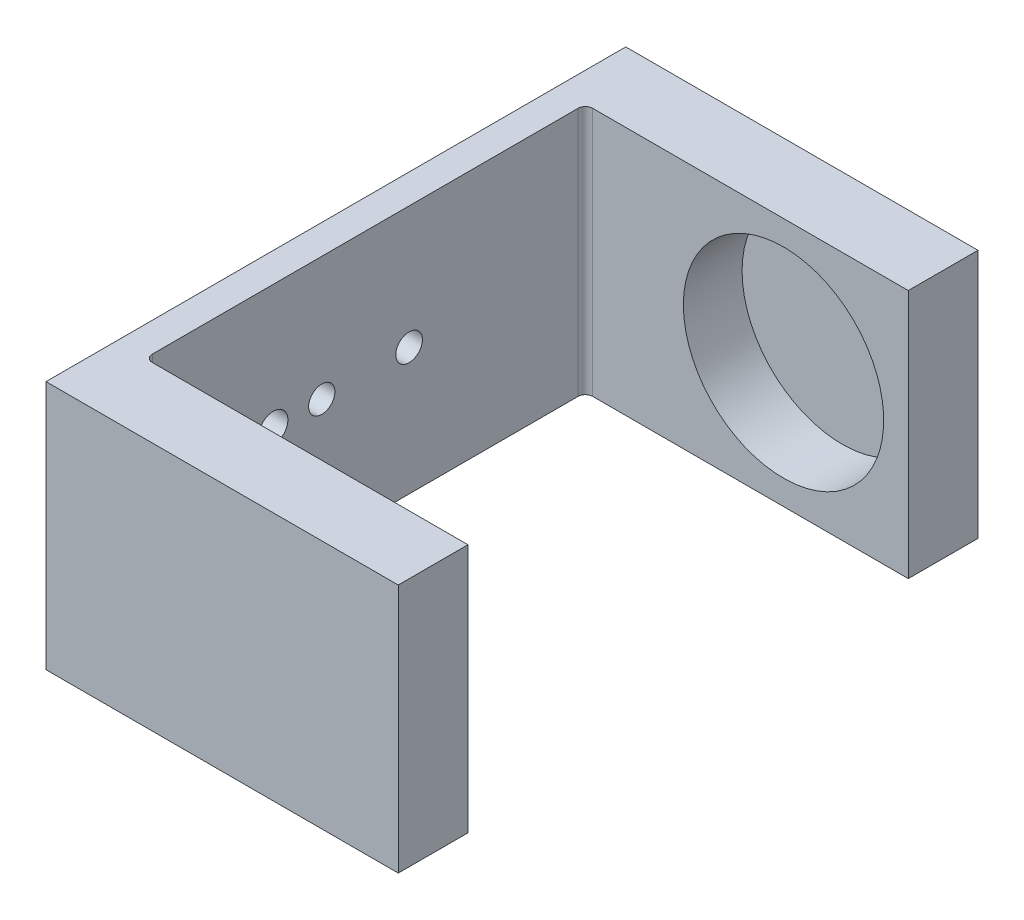
ISO-10303-21;
HEADER;
FILE_DESCRIPTION(('STEP AP214'),'2;1');
FILE_NAME('part.step','',(''),(''),'','','');
FILE_SCHEMA(('AUTOMOTIVE_DESIGN { 1 0 10303 214 1 1 1 1 }'));
ENDSEC;
DATA;
#1=APPLICATION_CONTEXT('core data for automotive mechanical design processes');
#2=APPLICATION_PROTOCOL_DEFINITION('international standard','automotive_design',2000,#1);
#3=PRODUCT_CONTEXT('',#1,'mechanical');
#4=PRODUCT('Part','Part','',(#3));
#5=PRODUCT_RELATED_PRODUCT_CATEGORY('part','',(#4));
#6=PRODUCT_DEFINITION_FORMATION('','',#4);
#7=PRODUCT_DEFINITION_CONTEXT('part definition',#1,'design');
#8=PRODUCT_DEFINITION('design','',#6,#7);
#9=PRODUCT_DEFINITION_SHAPE('','',#8);
#10=(LENGTH_UNIT() NAMED_UNIT(*) SI_UNIT(.MILLI.,.METRE.));
#11=(NAMED_UNIT(*) PLANE_ANGLE_UNIT() SI_UNIT($,.RADIAN.));
#12=(NAMED_UNIT(*) SI_UNIT($,.STERADIAN.) SOLID_ANGLE_UNIT());
#13=UNCERTAINTY_MEASURE_WITH_UNIT(LENGTH_MEASURE(1.E-05),#10,'distance_accuracy_value','');
#14=(GEOMETRIC_REPRESENTATION_CONTEXT(3) GLOBAL_UNCERTAINTY_ASSIGNED_CONTEXT((#13)) GLOBAL_UNIT_ASSIGNED_CONTEXT((#10,
#11,#12)) REPRESENTATION_CONTEXT('',''));
#15=CARTESIAN_POINT('',(0.,0.,0.));
#16=DIRECTION('',(0.,0.,1.));
#17=DIRECTION('',(1.,0.,0.));
#18=AXIS2_PLACEMENT_3D('',#15,#16,#17);
#19=CARTESIAN_POINT('',(0.,0.,0.));
#20=DIRECTION('',(1.,0.,0.));
#21=DIRECTION('',(0.,0.,-1.));
#22=AXIS2_PLACEMENT_3D('',#19,#20,#21);
#23=PLANE('',#22);
#24=CARTESIAN_POINT('',(0.,0.0292516399309797,15.0223875708356));
#25=DIRECTION('',(1.,0.,0.));
#26=DIRECTION('',(0.,0.,-1.));
#27=AXIS2_PLACEMENT_3D('',#24,#25,#26);
#28=CIRCLE('',#27,1.98896117743456);
#29=CARTESIAN_POINT('',(0.,0.0292516399309797,13.0334263934011));
#30=VERTEX_POINT('',#29);
#31=EDGE_CURVE('E257',#30,#30,#28,.T.);
#32=ORIENTED_EDGE('',*,*,#31,.F.);
#33=EDGE_LOOP('',(#32));
#34=FACE_BOUND('',#33,.T.);
#35=CARTESIAN_POINT('',(0.,0.314468999115995,-3.47781030124664));
#36=DIRECTION('',(1.,0.,0.));
#37=DIRECTION('',(0.,0.,-1.));
#38=AXIS2_PLACEMENT_3D('',#35,#36,#37);
#39=CIRCLE('',#38,1.81700148558305);
#40=CARTESIAN_POINT('',(0.,0.314468999115995,-5.29481178682969));
#41=VERTEX_POINT('',#40);
#42=EDGE_CURVE('E252',#41,#41,#39,.T.);
#43=ORIENTED_EDGE('',*,*,#42,.F.);
#44=EDGE_LOOP('',(#43));
#45=FACE_BOUND('',#44,.T.);
#46=CARTESIAN_POINT('',(0.,0.135590330107091,8.42214558473276));
#47=DIRECTION('',(1.,0.,0.));
#48=DIRECTION('',(0.,0.,-1.));
#49=AXIS2_PLACEMENT_3D('',#46,#47,#48);
#50=CIRCLE('',#49,1.79263833687023);
#51=CARTESIAN_POINT('',(0.,0.135590330107091,6.62950724786254));
#52=VERTEX_POINT('',#51);
#53=EDGE_CURVE('E172',#52,#52,#50,.T.);
#54=ORIENTED_EDGE('',*,*,#53,.F.);
#55=EDGE_LOOP('',(#54));
#56=FACE_BOUND('',#55,.T.);
#57=DIRECTION('',(0.,0.,-1.));
#58=VECTOR('',#57,1.);
#59=CARTESIAN_POINT('',(0.,-17.,32.5));
#60=LINE('',#59,#58);
#61=CARTESIAN_POINT('',(0.,-17.,31.5));
#62=VERTEX_POINT('',#61);
#63=CARTESIAN_POINT('',(0.,-17.,-26.5));
#64=VERTEX_POINT('',#63);
#65=EDGE_CURVE('E121',#62,#64,#60,.T.);
#66=ORIENTED_EDGE('',*,*,#65,.T.);
#67=DIRECTION('',(0.,1.,0.));
#68=VECTOR('',#67,1.);
#69=CARTESIAN_POINT('',(0.,0.,-26.5));
#70=LINE('',#69,#68);
#71=CARTESIAN_POINT('',(0.,17.,-26.5));
#72=VERTEX_POINT('',#71);
#73=EDGE_CURVE('E193',#64,#72,#70,.T.);
#74=ORIENTED_EDGE('',*,*,#73,.T.);
#75=DIRECTION('',(0.,0.,1.));
#76=VECTOR('',#75,1.);
#77=CARTESIAN_POINT('',(0.,17.,32.5));
#78=LINE('',#77,#76);
#79=CARTESIAN_POINT('',(0.,17.,31.5));
#80=VERTEX_POINT('',#79);
#81=EDGE_CURVE('E176',#72,#80,#78,.T.);
#82=ORIENTED_EDGE('',*,*,#81,.T.);
#83=DIRECTION('',(0.,-1.,0.));
#84=VECTOR('',#83,1.);
#85=CARTESIAN_POINT('',(0.,0.,31.5));
#86=LINE('',#85,#84);
#87=EDGE_CURVE('E180',#80,#62,#86,.T.);
#88=ORIENTED_EDGE('',*,*,#87,.T.);
#89=EDGE_LOOP('',(#66,#74,#82,#88));
#90=FACE_BOUND('',#89,.T.);
#91=ADVANCED_FACE('F33',(#34,#45,#56,#90),#23,.T.);
#92=CARTESIAN_POINT('',(-4.,-17.,32.5));
#93=DIRECTION('',(0.,-1.,0.));
#94=DIRECTION('',(0.,0.,-1.));
#95=AXIS2_PLACEMENT_3D('',#92,#93,#94);
#96=PLANE('',#95);
#97=DIRECTION('',(1.,0.,0.));
#98=VECTOR('',#97,1.);
#99=CARTESIAN_POINT('',(-4.,-17.,-27.5));
#100=LINE('',#99,#98);
#101=CARTESIAN_POINT('',(1.,-17.,-27.5));
#102=VERTEX_POINT('',#101);
#103=CARTESIAN_POINT('',(44.,-17.,-27.5));
#104=VERTEX_POINT('',#103);
#105=EDGE_CURVE('E131',#102,#104,#100,.T.);
#106=ORIENTED_EDGE('',*,*,#105,.F.);
#107=CARTESIAN_POINT('',(1.,-17.,-26.5));
#108=DIRECTION('',(0.,-1.,0.));
#109=DIRECTION('',(0.,0.,-1.));
#110=AXIS2_PLACEMENT_3D('',#107,#108,#109);
#111=CIRCLE('',#110,1.);
#112=EDGE_CURVE('E11',#102,#64,#111,.F.);
#113=ORIENTED_EDGE('',*,*,#112,.T.);
#114=ORIENTED_EDGE('',*,*,#65,.F.);
#115=CARTESIAN_POINT('',(1.,-17.,31.5));
#116=DIRECTION('',(0.,-1.,0.));
#117=DIRECTION('',(0.,0.,-1.));
#118=AXIS2_PLACEMENT_3D('',#115,#116,#117);
#119=CIRCLE('',#118,1.);
#120=CARTESIAN_POINT('',(1.,-17.,32.5));
#121=VERTEX_POINT('',#120);
#122=EDGE_CURVE('E188',#62,#121,#119,.F.);
#123=ORIENTED_EDGE('',*,*,#122,.T.);
#124=DIRECTION('',(1.,0.,0.));
#125=VECTOR('',#124,1.);
#126=CARTESIAN_POINT('',(-4.,-17.,32.5));
#127=LINE('',#126,#125);
#128=CARTESIAN_POINT('',(44.,-17.,32.5));
#129=VERTEX_POINT('',#128);
#130=EDGE_CURVE('E152',#121,#129,#127,.T.);
#131=ORIENTED_EDGE('',*,*,#130,.T.);
#132=DIRECTION('',(0.,0.,-1.));
#133=VECTOR('',#132,1.);
#134=CARTESIAN_POINT('',(44.,-17.,42.));
#135=LINE('',#134,#133);
#136=CARTESIAN_POINT('',(44.,-17.,42.));
#137=VERTEX_POINT('',#136);
#138=EDGE_CURVE('E169',#137,#129,#135,.T.);
#139=ORIENTED_EDGE('',*,*,#138,.F.);
#140=DIRECTION('',(1.,0.,0.));
#141=VECTOR('',#140,1.);
#142=CARTESIAN_POINT('',(-4.,-17.,42.));
#143=LINE('',#142,#141);
#144=CARTESIAN_POINT('',(-4.,-17.,42.));
#145=VERTEX_POINT('',#144);
#146=EDGE_CURVE('E154',#145,#137,#143,.T.);
#147=ORIENTED_EDGE('',*,*,#146,.F.);
#148=DIRECTION('',(0.,0.,-1.));
#149=VECTOR('',#148,1.);
#150=CARTESIAN_POINT('',(-4.,-17.,32.5));
#151=LINE('',#150,#149);
#152=CARTESIAN_POINT('',(-4.,-17.,-37.));
#153=VERTEX_POINT('',#152);
#154=EDGE_CURVE('E120',#145,#153,#151,.T.);
#155=ORIENTED_EDGE('',*,*,#154,.T.);
#156=DIRECTION('',(1.,0.,0.));
#157=VECTOR('',#156,1.);
#158=CARTESIAN_POINT('',(-4.,-17.,-37.));
#159=LINE('',#158,#157);
#160=CARTESIAN_POINT('',(44.,-17.,-37.));
#161=VERTEX_POINT('',#160);
#162=EDGE_CURVE('E130',#153,#161,#159,.T.);
#163=ORIENTED_EDGE('',*,*,#162,.T.);
#164=DIRECTION('',(0.,0.,1.));
#165=VECTOR('',#164,1.);
#166=CARTESIAN_POINT('',(44.,-17.,-37.));
#167=LINE('',#166,#165);
#168=EDGE_CURVE('E141',#161,#104,#167,.T.);
#169=ORIENTED_EDGE('',*,*,#168,.T.);
#170=EDGE_LOOP('',(#106,#113,#114,#123,#131,#139,#147,#155,#163,#169));
#171=FACE_BOUND('',#170,.T.);
#172=ADVANCED_FACE('F208',(#171),#96,.T.);
#173=CARTESIAN_POINT('',(-4.,17.,32.5));
#174=DIRECTION('',(0.,1.,0.));
#175=DIRECTION('',(0.,0.,1.));
#176=AXIS2_PLACEMENT_3D('',#173,#174,#175);
#177=PLANE('',#176);
#178=DIRECTION('',(0.,0.,1.));
#179=VECTOR('',#178,1.);
#180=CARTESIAN_POINT('',(-4.,17.,32.5));
#181=LINE('',#180,#179);
#182=CARTESIAN_POINT('',(-4.,17.,-37.));
#183=VERTEX_POINT('',#182);
#184=CARTESIAN_POINT('',(-4.,17.,42.));
#185=VERTEX_POINT('',#184);
#186=EDGE_CURVE('E109',#183,#185,#181,.T.);
#187=ORIENTED_EDGE('',*,*,#186,.T.);
#188=DIRECTION('',(-1.,0.,0.));
#189=VECTOR('',#188,1.);
#190=CARTESIAN_POINT('',(-4.,17.,42.));
#191=LINE('',#190,#189);
#192=CARTESIAN_POINT('',(44.,17.,42.));
#193=VERTEX_POINT('',#192);
#194=EDGE_CURVE('E159',#193,#185,#191,.T.);
#195=ORIENTED_EDGE('',*,*,#194,.F.);
#196=DIRECTION('',(0.,0.,-1.));
#197=VECTOR('',#196,1.);
#198=CARTESIAN_POINT('',(44.,17.,42.));
#199=LINE('',#198,#197);
#200=CARTESIAN_POINT('',(44.,17.,32.5));
#201=VERTEX_POINT('',#200);
#202=EDGE_CURVE('E161',#193,#201,#199,.T.);
#203=ORIENTED_EDGE('',*,*,#202,.T.);
#204=DIRECTION('',(-1.,0.,0.));
#205=VECTOR('',#204,1.);
#206=CARTESIAN_POINT('',(-4.,17.,32.5));
#207=LINE('',#206,#205);
#208=CARTESIAN_POINT('',(1.,17.,32.5));
#209=VERTEX_POINT('',#208);
#210=EDGE_CURVE('E155',#201,#209,#207,.T.);
#211=ORIENTED_EDGE('',*,*,#210,.T.);
#212=CARTESIAN_POINT('',(1.,17.,31.5));
#213=DIRECTION('',(0.,1.,0.));
#214=DIRECTION('',(0.,0.,1.));
#215=AXIS2_PLACEMENT_3D('',#212,#213,#214);
#216=CIRCLE('',#215,1.);
#217=EDGE_CURVE('E190',#209,#80,#216,.F.);
#218=ORIENTED_EDGE('',*,*,#217,.T.);
#219=ORIENTED_EDGE('',*,*,#81,.F.);
#220=CARTESIAN_POINT('',(1.,17.,-26.5));
#221=DIRECTION('',(0.,1.,0.));
#222=DIRECTION('',(0.,0.,1.));
#223=AXIS2_PLACEMENT_3D('',#220,#221,#222);
#224=CIRCLE('',#223,1.);
#225=CARTESIAN_POINT('',(1.,17.,-27.5));
#226=VERTEX_POINT('',#225);
#227=EDGE_CURVE('E41',#72,#226,#224,.F.);
#228=ORIENTED_EDGE('',*,*,#227,.T.);
#229=DIRECTION('',(-1.,0.,0.));
#230=VECTOR('',#229,1.);
#231=CARTESIAN_POINT('',(-4.,17.,-27.5));
#232=LINE('',#231,#230);
#233=CARTESIAN_POINT('',(44.,17.,-27.5));
#234=VERTEX_POINT('',#233);
#235=EDGE_CURVE('E142',#234,#226,#232,.T.);
#236=ORIENTED_EDGE('',*,*,#235,.F.);
#237=DIRECTION('',(0.,0.,1.));
#238=VECTOR('',#237,1.);
#239=CARTESIAN_POINT('',(44.,17.,-37.));
#240=LINE('',#239,#238);
#241=CARTESIAN_POINT('',(44.,17.,-37.));
#242=VERTEX_POINT('',#241);
#243=EDGE_CURVE('E134',#242,#234,#240,.T.);
#244=ORIENTED_EDGE('',*,*,#243,.F.);
#245=DIRECTION('',(-1.,0.,0.));
#246=VECTOR('',#245,1.);
#247=CARTESIAN_POINT('',(-4.,17.,-37.));
#248=LINE('',#247,#246);
#249=EDGE_CURVE('E127',#242,#183,#248,.T.);
#250=ORIENTED_EDGE('',*,*,#249,.T.);
#251=EDGE_LOOP('',(#187,#195,#203,#211,#218,#219,#228,#236,#244,#250));
#252=FACE_BOUND('',#251,.T.);
#253=ADVANCED_FACE('F133',(#252),#177,.T.);
#254=CARTESIAN_POINT('',(-4.,0.,0.));
#255=DIRECTION('',(1.,0.,0.));
#256=DIRECTION('',(0.,0.,-1.));
#257=AXIS2_PLACEMENT_3D('',#254,#255,#256);
#258=PLANE('',#257);
#259=CARTESIAN_POINT('',(-4.,0.0292516399309797,15.0223875708356));
#260=DIRECTION('',(-1.,0.,0.));
#261=DIRECTION('',(0.,0.,1.));
#262=AXIS2_PLACEMENT_3D('',#259,#260,#261);
#263=CIRCLE('',#262,1.98896117743456);
#264=CARTESIAN_POINT('',(-4.,0.0292516399309797,17.0113487482702));
#265=VERTEX_POINT('',#264);
#266=EDGE_CURVE('E246',#265,#265,#263,.T.);
#267=ORIENTED_EDGE('',*,*,#266,.F.);
#268=EDGE_LOOP('',(#267));
#269=FACE_BOUND('',#268,.T.);
#270=CARTESIAN_POINT('',(-4.,0.314468999115995,-3.47781030124664));
#271=DIRECTION('',(-1.,0.,0.));
#272=DIRECTION('',(0.,0.,1.));
#273=AXIS2_PLACEMENT_3D('',#270,#271,#272);
#274=CIRCLE('',#273,1.81700148558305);
#275=CARTESIAN_POINT('',(-4.,0.314468999115995,-1.66080881566359));
#276=VERTEX_POINT('',#275);
#277=EDGE_CURVE('E249',#276,#276,#274,.T.);
#278=ORIENTED_EDGE('',*,*,#277,.F.);
#279=EDGE_LOOP('',(#278));
#280=FACE_BOUND('',#279,.T.);
#281=DIRECTION('',(0.,-1.,0.));
#282=VECTOR('',#281,1.);
#283=CARTESIAN_POINT('',(-4.,17.,-37.));
#284=LINE('',#283,#282);
#285=EDGE_CURVE('E113',#183,#153,#284,.T.);
#286=ORIENTED_EDGE('',*,*,#285,.T.);
#287=ORIENTED_EDGE('',*,*,#154,.F.);
#288=DIRECTION('',(0.,-1.,0.));
#289=VECTOR('',#288,1.);
#290=CARTESIAN_POINT('',(-4.,17.,42.));
#291=LINE('',#290,#289);
#292=EDGE_CURVE('E116',#185,#145,#291,.T.);
#293=ORIENTED_EDGE('',*,*,#292,.F.);
#294=ORIENTED_EDGE('',*,*,#186,.F.);
#295=EDGE_LOOP('',(#286,#287,#293,#294));
#296=FACE_BOUND('',#295,.T.);
#297=CARTESIAN_POINT('',(-4.,0.135590330107091,8.42214558473276));
#298=DIRECTION('',(1.,0.,0.));
#299=DIRECTION('',(0.,0.,-1.));
#300=AXIS2_PLACEMENT_3D('',#297,#298,#299);
#301=CIRCLE('',#300,1.79263833687023);
#302=CARTESIAN_POINT('',(-4.,0.135590330107091,6.62950724786254));
#303=VERTEX_POINT('',#302);
#304=EDGE_CURVE('E173',#303,#303,#301,.T.);
#305=ORIENTED_EDGE('',*,*,#304,.T.);
#306=EDGE_LOOP('',(#305));
#307=FACE_BOUND('',#306,.T.);
#308=ADVANCED_FACE('F111',(#269,#280,#296,#307),#258,.F.);
#309=CARTESIAN_POINT('',(-4.,0.135590330107091,8.42214558473276));
#310=DIRECTION('',(1.,0.,0.));
#311=DIRECTION('',(0.,0.,-1.));
#312=AXIS2_PLACEMENT_3D('',#309,#310,#311);
#313=CYLINDRICAL_SURFACE('',#312,1.79263833687023);
#314=ORIENTED_EDGE('',*,*,#304,.F.);
#315=EDGE_LOOP('',(#314));
#316=FACE_BOUND('',#315,.T.);
#317=ORIENTED_EDGE('',*,*,#53,.T.);
#318=EDGE_LOOP('',(#317));
#319=FACE_BOUND('',#318,.T.);
#320=ADVANCED_FACE('F236',(#316,#319),#313,.F.);
#321=CARTESIAN_POINT('',(44.,17.,42.));
#322=DIRECTION('',(-1.,0.,0.));
#323=DIRECTION('',(0.,-1.,0.));
#324=AXIS2_PLACEMENT_3D('',#321,#322,#323);
#325=PLANE('',#324);
#326=DIRECTION('',(0.,1.,0.));
#327=VECTOR('',#326,1.);
#328=CARTESIAN_POINT('',(44.,17.,32.5));
#329=LINE('',#328,#327);
#330=EDGE_CURVE('E163',#129,#201,#329,.T.);
#331=ORIENTED_EDGE('',*,*,#330,.T.);
#332=ORIENTED_EDGE('',*,*,#202,.F.);
#333=DIRECTION('',(0.,1.,0.));
#334=VECTOR('',#333,1.);
#335=CARTESIAN_POINT('',(44.,17.,42.));
#336=LINE('',#335,#334);
#337=EDGE_CURVE('E157',#137,#193,#336,.T.);
#338=ORIENTED_EDGE('',*,*,#337,.F.);
#339=ORIENTED_EDGE('',*,*,#138,.T.);
#340=EDGE_LOOP('',(#331,#332,#338,#339));
#341=FACE_BOUND('',#340,.T.);
#342=ADVANCED_FACE('F241',(#341),#325,.F.);
#343=CARTESIAN_POINT('',(0.,0.,42.));
#344=DIRECTION('',(0.,0.,1.));
#345=DIRECTION('',(1.,0.,0.));
#346=AXIS2_PLACEMENT_3D('',#343,#344,#345);
#347=PLANE('',#346);
#348=ORIENTED_EDGE('',*,*,#292,.T.);
#349=ORIENTED_EDGE('',*,*,#146,.T.);
#350=ORIENTED_EDGE('',*,*,#337,.T.);
#351=ORIENTED_EDGE('',*,*,#194,.T.);
#352=EDGE_LOOP('',(#348,#349,#350,#351));
#353=FACE_BOUND('',#352,.T.);
#354=ADVANCED_FACE('F276',(#353),#347,.T.);
#355=CARTESIAN_POINT('',(0.,0.,32.5));
#356=DIRECTION('',(0.,0.,1.));
#357=DIRECTION('',(1.,0.,0.));
#358=AXIS2_PLACEMENT_3D('',#355,#356,#357);
#359=PLANE('',#358);
#360=CARTESIAN_POINT('',(27.,0.,32.5));
#361=DIRECTION('',(0.,0.,-1.));
#362=DIRECTION('',(-1.,0.,0.));
#363=AXIS2_PLACEMENT_3D('',#360,#361,#362);
#364=CIRCLE('',#363,13.65);
#365=CARTESIAN_POINT('',(13.35,0.,32.5));
#366=VERTEX_POINT('',#365);
#367=EDGE_CURVE('E264',#366,#366,#364,.T.);
#368=ORIENTED_EDGE('',*,*,#367,.F.);
#369=EDGE_LOOP('',(#368));
#370=FACE_BOUND('',#369,.T.);
#371=ORIENTED_EDGE('',*,*,#130,.F.);
#372=DIRECTION('',(0.,-1.,0.));
#373=VECTOR('',#372,1.);
#374=CARTESIAN_POINT('',(1.,0.,32.5));
#375=LINE('',#374,#373);
#376=EDGE_CURVE('E186',#121,#209,#375,.F.);
#377=ORIENTED_EDGE('',*,*,#376,.T.);
#378=ORIENTED_EDGE('',*,*,#210,.F.);
#379=ORIENTED_EDGE('',*,*,#330,.F.);
#380=EDGE_LOOP('',(#371,#377,#378,#379));
#381=FACE_BOUND('',#380,.T.);
#382=ADVANCED_FACE('F272',(#370,#381),#359,.F.);
#383=CARTESIAN_POINT('',(44.,17.,-37.));
#384=DIRECTION('',(1.,0.,0.));
#385=DIRECTION('',(0.,1.,0.));
#386=AXIS2_PLACEMENT_3D('',#383,#384,#385);
#387=PLANE('',#386);
#388=DIRECTION('',(0.,1.,0.));
#389=VECTOR('',#388,1.);
#390=CARTESIAN_POINT('',(44.,17.,-27.5));
#391=LINE('',#390,#389);
#392=EDGE_CURVE('E144',#104,#234,#391,.T.);
#393=ORIENTED_EDGE('',*,*,#392,.F.);
#394=ORIENTED_EDGE('',*,*,#168,.F.);
#395=DIRECTION('',(0.,1.,0.));
#396=VECTOR('',#395,1.);
#397=CARTESIAN_POINT('',(44.,17.,-37.));
#398=LINE('',#397,#396);
#399=EDGE_CURVE('E135',#161,#242,#398,.T.);
#400=ORIENTED_EDGE('',*,*,#399,.T.);
#401=ORIENTED_EDGE('',*,*,#243,.T.);
#402=EDGE_LOOP('',(#393,#394,#400,#401));
#403=FACE_BOUND('',#402,.T.);
#404=ADVANCED_FACE('F275',(#403),#387,.T.);
#405=CARTESIAN_POINT('',(0.,0.,-37.));
#406=DIRECTION('',(0.,0.,-1.));
#407=DIRECTION('',(1.,0.,0.));
#408=AXIS2_PLACEMENT_3D('',#405,#406,#407);
#409=PLANE('',#408);
#410=ORIENTED_EDGE('',*,*,#285,.F.);
#411=ORIENTED_EDGE('',*,*,#249,.F.);
#412=ORIENTED_EDGE('',*,*,#399,.F.);
#413=ORIENTED_EDGE('',*,*,#162,.F.);
#414=EDGE_LOOP('',(#410,#411,#412,#413));
#415=FACE_BOUND('',#414,.T.);
#416=ADVANCED_FACE('F125',(#415),#409,.T.);
#417=CARTESIAN_POINT('',(0.,0.,-27.5));
#418=DIRECTION('',(0.,0.,-1.));
#419=DIRECTION('',(1.,0.,0.));
#420=AXIS2_PLACEMENT_3D('',#417,#418,#419);
#421=PLANE('',#420);
#422=CARTESIAN_POINT('',(27.,0.,-27.5));
#423=DIRECTION('',(0.,0.,-1.));
#424=DIRECTION('',(-1.,0.,0.));
#425=AXIS2_PLACEMENT_3D('',#422,#423,#424);
#426=CIRCLE('',#425,13.65);
#427=CARTESIAN_POINT('',(13.35,0.,-27.5));
#428=VERTEX_POINT('',#427);
#429=EDGE_CURVE('E260',#428,#428,#426,.T.);
#430=ORIENTED_EDGE('',*,*,#429,.T.);
#431=EDGE_LOOP('',(#430));
#432=FACE_BOUND('',#431,.T.);
#433=ORIENTED_EDGE('',*,*,#235,.T.);
#434=DIRECTION('',(0.,1.,0.));
#435=VECTOR('',#434,1.);
#436=CARTESIAN_POINT('',(1.,0.,-27.5));
#437=LINE('',#436,#435);
#438=EDGE_CURVE('E54',#226,#102,#437,.F.);
#439=ORIENTED_EDGE('',*,*,#438,.T.);
#440=ORIENTED_EDGE('',*,*,#105,.T.);
#441=ORIENTED_EDGE('',*,*,#392,.T.);
#442=EDGE_LOOP('',(#433,#439,#440,#441));
#443=FACE_BOUND('',#442,.T.);
#444=ADVANCED_FACE('F219',(#432,#443),#421,.F.);
#445=CARTESIAN_POINT('',(1.,0.,31.5));
#446=DIRECTION('',(0.,-1.,0.));
#447=DIRECTION('',(0.,0.,-1.));
#448=AXIS2_PLACEMENT_3D('',#445,#446,#447);
#449=CYLINDRICAL_SURFACE('',#448,1.);
#450=ORIENTED_EDGE('',*,*,#217,.F.);
#451=ORIENTED_EDGE('',*,*,#376,.F.);
#452=ORIENTED_EDGE('',*,*,#122,.F.);
#453=ORIENTED_EDGE('',*,*,#87,.F.);
#454=EDGE_LOOP('',(#450,#451,#452,#453));
#455=FACE_BOUND('',#454,.T.);
#456=ADVANCED_FACE('F206',(#455),#449,.F.);
#457=CARTESIAN_POINT('',(1.,0.,-26.5));
#458=DIRECTION('',(0.,1.,0.));
#459=DIRECTION('',(0.,0.,1.));
#460=AXIS2_PLACEMENT_3D('',#457,#458,#459);
#461=CYLINDRICAL_SURFACE('',#460,1.);
#462=ORIENTED_EDGE('',*,*,#112,.F.);
#463=ORIENTED_EDGE('',*,*,#438,.F.);
#464=ORIENTED_EDGE('',*,*,#227,.F.);
#465=ORIENTED_EDGE('',*,*,#73,.F.);
#466=EDGE_LOOP('',(#462,#463,#464,#465));
#467=FACE_BOUND('',#466,.T.);
#468=ADVANCED_FACE('F35',(#467),#461,.F.);
#469=CARTESIAN_POINT('',(27.,0.,40.5));
#470=DIRECTION('',(0.,0.,-1.));
#471=DIRECTION('',(-1.,0.,0.));
#472=AXIS2_PLACEMENT_3D('',#469,#470,#471);
#473=CYLINDRICAL_SURFACE('',#472,13.65);
#474=CARTESIAN_POINT('',(27.,0.,40.5));
#475=DIRECTION('',(0.,0.,-1.));
#476=DIRECTION('',(-1.,0.,0.));
#477=AXIS2_PLACEMENT_3D('',#474,#475,#476);
#478=CIRCLE('',#477,13.65);
#479=CARTESIAN_POINT('',(13.35,0.,40.5));
#480=VERTEX_POINT('',#479);
#481=EDGE_CURVE('E145',#480,#480,#478,.T.);
#482=ORIENTED_EDGE('',*,*,#481,.F.);
#483=EDGE_LOOP('',(#482));
#484=FACE_BOUND('',#483,.T.);
#485=ORIENTED_EDGE('',*,*,#367,.T.);
#486=EDGE_LOOP('',(#485));
#487=FACE_BOUND('',#486,.T.);
#488=ADVANCED_FACE('F211',(#484,#487),#473,.F.);
#489=CARTESIAN_POINT('',(27.,0.,40.5));
#490=DIRECTION('',(0.,0.,-1.));
#491=DIRECTION('',(-1.,0.,0.));
#492=AXIS2_PLACEMENT_3D('',#489,#490,#491);
#493=PLANE('',#492);
#494=ORIENTED_EDGE('',*,*,#481,.T.);
#495=EDGE_LOOP('',(#494));
#496=FACE_BOUND('',#495,.T.);
#497=ADVANCED_FACE('F216',(#496),#493,.T.);
#498=CARTESIAN_POINT('',(27.,0.,-35.5));
#499=DIRECTION('',(0.,0.,1.));
#500=DIRECTION('',(1.,0.,0.));
#501=AXIS2_PLACEMENT_3D('',#498,#499,#500);
#502=CYLINDRICAL_SURFACE('',#501,13.65);
#503=CARTESIAN_POINT('',(27.,0.,-35.5));
#504=DIRECTION('',(0.,0.,-1.));
#505=DIRECTION('',(-1.,0.,0.));
#506=AXIS2_PLACEMENT_3D('',#503,#504,#505);
#507=CIRCLE('',#506,13.65);
#508=CARTESIAN_POINT('',(13.35,0.,-35.5));
#509=VERTEX_POINT('',#508);
#510=EDGE_CURVE('E261',#509,#509,#507,.T.);
#511=ORIENTED_EDGE('',*,*,#510,.T.);
#512=EDGE_LOOP('',(#511));
#513=FACE_BOUND('',#512,.T.);
#514=ORIENTED_EDGE('',*,*,#429,.F.);
#515=EDGE_LOOP('',(#514));
#516=FACE_BOUND('',#515,.T.);
#517=ADVANCED_FACE('F360',(#513,#516),#502,.F.);
#518=CARTESIAN_POINT('',(27.,0.,-35.5));
#519=DIRECTION('',(0.,0.,1.));
#520=DIRECTION('',(-1.,0.,0.));
#521=AXIS2_PLACEMENT_3D('',#518,#519,#520);
#522=PLANE('',#521);
#523=ORIENTED_EDGE('',*,*,#510,.F.);
#524=EDGE_LOOP('',(#523));
#525=FACE_BOUND('',#524,.T.);
#526=ADVANCED_FACE('F369',(#525),#522,.T.);
#527=CARTESIAN_POINT('',(6.,0.314468999115995,-3.47781030124664));
#528=DIRECTION('',(-1.,0.,0.));
#529=DIRECTION('',(0.,0.,1.));
#530=AXIS2_PLACEMENT_3D('',#527,#528,#529);
#531=CYLINDRICAL_SURFACE('',#530,1.81700148558305);
#532=ORIENTED_EDGE('',*,*,#42,.T.);
#533=EDGE_LOOP('',(#532));
#534=FACE_BOUND('',#533,.T.);
#535=ORIENTED_EDGE('',*,*,#277,.T.);
#536=EDGE_LOOP('',(#535));
#537=FACE_BOUND('',#536,.T.);
#538=ADVANCED_FACE('F378',(#534,#537),#531,.F.);
#539=CARTESIAN_POINT('',(6.,0.0292516399309797,15.0223875708356));
#540=DIRECTION('',(-1.,0.,0.));
#541=DIRECTION('',(0.,0.,1.));
#542=AXIS2_PLACEMENT_3D('',#539,#540,#541);
#543=CYLINDRICAL_SURFACE('',#542,1.98896117743456);
#544=ORIENTED_EDGE('',*,*,#31,.T.);
#545=EDGE_LOOP('',(#544));
#546=FACE_BOUND('',#545,.T.);
#547=ORIENTED_EDGE('',*,*,#266,.T.);
#548=EDGE_LOOP('',(#547));
#549=FACE_BOUND('',#548,.T.);
#550=ADVANCED_FACE('F387',(#546,#549),#543,.F.);
#551=CLOSED_SHELL('',(#91,#172,#253,#308,#320,#342,#354,#382,#404,#416,#444,#456,#468,#488,#497,
#517,#526,#538,#550));
#552=MANIFOLD_SOLID_BREP('B2',#551);
#553=ADVANCED_BREP_SHAPE_REPRESENTATION('',(#18,#552),#14);
#554=SHAPE_DEFINITION_REPRESENTATION(#9,#553);
ENDSEC;
END-ISO-10303-21;
